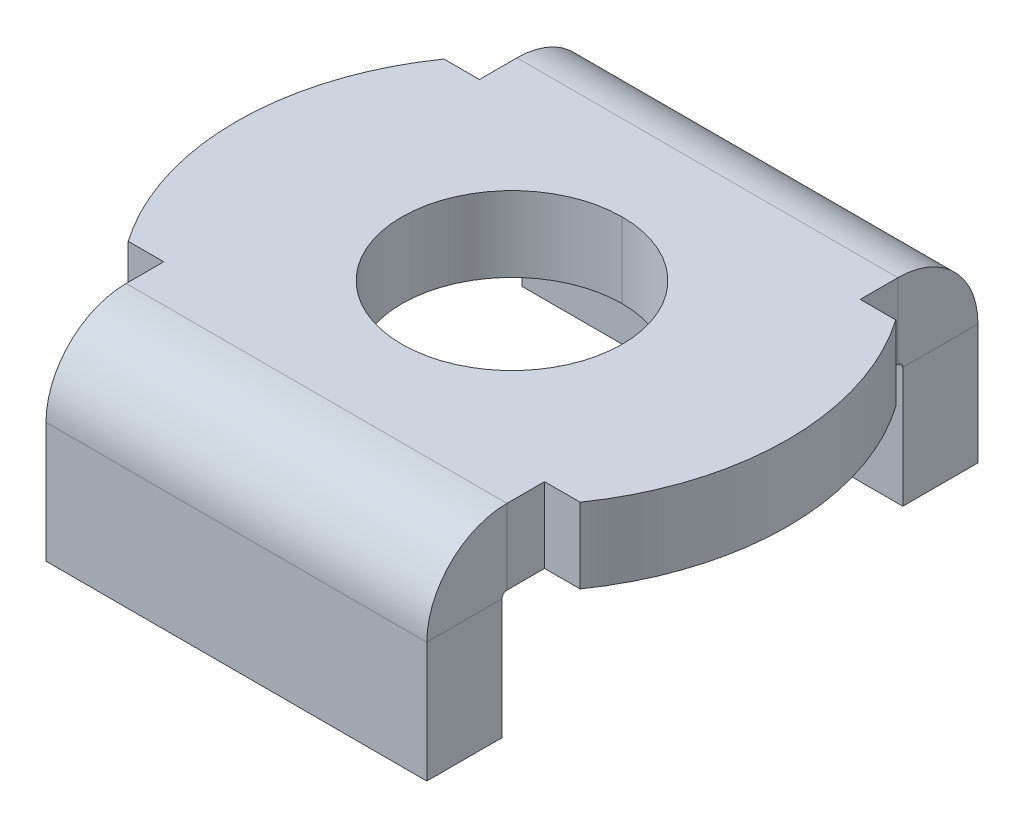
ISO-10303-21;
HEADER;
FILE_DESCRIPTION(('STEP AP214'),'2;1');
FILE_NAME('part.step','',(''),(''),'','','');
FILE_SCHEMA(('AUTOMOTIVE_DESIGN { 1 0 10303 214 1 1 1 1 }'));
ENDSEC;
DATA;
#1=APPLICATION_CONTEXT('core data for automotive mechanical design processes');
#2=APPLICATION_PROTOCOL_DEFINITION('international standard','automotive_design',2000,#1);
#3=PRODUCT_CONTEXT('',#1,'mechanical');
#4=PRODUCT('Part','Part','',(#3));
#5=PRODUCT_RELATED_PRODUCT_CATEGORY('part','',(#4));
#6=PRODUCT_DEFINITION_FORMATION('','',#4);
#7=PRODUCT_DEFINITION_CONTEXT('part definition',#1,'design');
#8=PRODUCT_DEFINITION('design','',#6,#7);
#9=PRODUCT_DEFINITION_SHAPE('','',#8);
#10=(LENGTH_UNIT() NAMED_UNIT(*) SI_UNIT(.MILLI.,.METRE.));
#11=(NAMED_UNIT(*) PLANE_ANGLE_UNIT() SI_UNIT($,.RADIAN.));
#12=(NAMED_UNIT(*) SI_UNIT($,.STERADIAN.) SOLID_ANGLE_UNIT());
#13=UNCERTAINTY_MEASURE_WITH_UNIT(LENGTH_MEASURE(1.E-05),#10,'distance_accuracy_value','');
#14=(GEOMETRIC_REPRESENTATION_CONTEXT(3) GLOBAL_UNCERTAINTY_ASSIGNED_CONTEXT((#13)) GLOBAL_UNIT_ASSIGNED_CONTEXT((#10,
#11,#12)) REPRESENTATION_CONTEXT('',''));
#15=CARTESIAN_POINT('',(0.,0.,0.));
#16=DIRECTION('',(0.,0.,1.));
#17=DIRECTION('',(1.,0.,0.));
#18=AXIS2_PLACEMENT_3D('',#15,#16,#17);
#19=CARTESIAN_POINT('',(-3.8,-4.,-5.5));
#20=DIRECTION('',(0.,1.,0.));
#21=DIRECTION('',(0.,0.,-1.));
#22=AXIS2_PLACEMENT_3D('',#19,#20,#21);
#23=PLANE('',#22);
#24=DIRECTION('',(-1.,0.,0.));
#25=VECTOR('',#24,1.);
#26=CARTESIAN_POINT('',(-3.8,-4.,-4.));
#27=LINE('',#26,#25);
#28=CARTESIAN_POINT('',(3.8,-4.,-4.));
#29=VERTEX_POINT('',#28);
#30=CARTESIAN_POINT('',(-3.8,-4.,-4.));
#31=VERTEX_POINT('',#30);
#32=EDGE_CURVE('E11',#29,#31,#27,.T.);
#33=ORIENTED_EDGE('',*,*,#32,.T.);
#34=DIRECTION('',(0.,0.,1.));
#35=VECTOR('',#34,1.);
#36=CARTESIAN_POINT('',(-3.8,-4.,-5.5));
#37=LINE('',#36,#35);
#38=CARTESIAN_POINT('',(-3.8,-4.,-5.5));
#39=VERTEX_POINT('',#38);
#40=EDGE_CURVE('E242',#39,#31,#37,.T.);
#41=ORIENTED_EDGE('',*,*,#40,.F.);
#42=DIRECTION('',(-1.,0.,0.));
#43=VECTOR('',#42,1.);
#44=CARTESIAN_POINT('',(-3.8,-4.,-5.5));
#45=LINE('',#44,#43);
#46=CARTESIAN_POINT('',(3.8,-4.,-5.5));
#47=VERTEX_POINT('',#46);
#48=EDGE_CURVE('E27',#47,#39,#45,.T.);
#49=ORIENTED_EDGE('',*,*,#48,.F.);
#50=DIRECTION('',(0.,0.,1.));
#51=VECTOR('',#50,1.);
#52=CARTESIAN_POINT('',(3.8,-4.,-5.5));
#53=LINE('',#52,#51);
#54=EDGE_CURVE('E508',#47,#29,#53,.T.);
#55=ORIENTED_EDGE('',*,*,#54,.T.);
#56=EDGE_LOOP('',(#33,#41,#49,#55));
#57=FACE_BOUND('',#56,.T.);
#58=ADVANCED_FACE('F17',(#57),#23,.F.);
#59=CARTESIAN_POINT('',(0.,0.,-4.));
#60=DIRECTION('',(0.,0.,1.));
#61=DIRECTION('',(0.,-1.,0.));
#62=AXIS2_PLACEMENT_3D('',#59,#60,#61);
#63=PLANE('',#62);
#64=DIRECTION('',(0.,-1.,0.));
#65=VECTOR('',#64,1.);
#66=CARTESIAN_POINT('',(3.8,-4.,-4.));
#67=LINE('',#66,#65);
#68=CARTESIAN_POINT('',(3.8,-1.6,-4.));
#69=VERTEX_POINT('',#68);
#70=EDGE_CURVE('E415',#69,#29,#67,.T.);
#71=ORIENTED_EDGE('',*,*,#70,.F.);
#72=DIRECTION('',(1.,0.,0.));
#73=VECTOR('',#72,1.);
#74=CARTESIAN_POINT('',(-3.8,-1.6,-4.));
#75=LINE('',#74,#73);
#76=CARTESIAN_POINT('',(-3.8,-1.6,-4.));
#77=VERTEX_POINT('',#76);
#78=EDGE_CURVE('E411',#77,#69,#75,.T.);
#79=ORIENTED_EDGE('',*,*,#78,.F.);
#80=DIRECTION('',(0.,1.,0.));
#81=VECTOR('',#80,1.);
#82=CARTESIAN_POINT('',(-3.8,-1.5,-4.));
#83=LINE('',#82,#81);
#84=EDGE_CURVE('E239',#31,#77,#83,.T.);
#85=ORIENTED_EDGE('',*,*,#84,.F.);
#86=ORIENTED_EDGE('',*,*,#32,.F.);
#87=EDGE_LOOP('',(#71,#79,#85,#86));
#88=FACE_BOUND('',#87,.T.);
#89=ADVANCED_FACE('F920',(#88),#63,.T.);
#90=CARTESIAN_POINT('',(0.,0.,-5.5));
#91=DIRECTION('',(0.,0.,1.));
#92=DIRECTION('',(0.,-1.,0.));
#93=AXIS2_PLACEMENT_3D('',#90,#91,#92);
#94=PLANE('',#93);
#95=DIRECTION('',(-1.,0.,0.));
#96=VECTOR('',#95,1.);
#97=CARTESIAN_POINT('',(0.,-1.6,-5.5));
#98=LINE('',#97,#96);
#99=CARTESIAN_POINT('',(3.8,-1.6,-5.5));
#100=VERTEX_POINT('',#99);
#101=CARTESIAN_POINT('',(-3.8,-1.6,-5.5));
#102=VERTEX_POINT('',#101);
#103=EDGE_CURVE('E21',#100,#102,#98,.T.);
#104=ORIENTED_EDGE('',*,*,#103,.F.);
#105=DIRECTION('',(0.,-1.,0.));
#106=VECTOR('',#105,1.);
#107=CARTESIAN_POINT('',(3.8,-4.,-5.5));
#108=LINE('',#107,#106);
#109=EDGE_CURVE('E410',#100,#47,#108,.T.);
#110=ORIENTED_EDGE('',*,*,#109,.T.);
#111=ORIENTED_EDGE('',*,*,#48,.T.);
#112=DIRECTION('',(0.,1.,0.));
#113=VECTOR('',#112,1.);
#114=CARTESIAN_POINT('',(-3.8,-1.5,-5.5));
#115=LINE('',#114,#113);
#116=EDGE_CURVE('E407',#39,#102,#115,.T.);
#117=ORIENTED_EDGE('',*,*,#116,.T.);
#118=EDGE_LOOP('',(#104,#110,#111,#117));
#119=FACE_BOUND('',#118,.T.);
#120=ADVANCED_FACE('F925',(#119),#94,.F.);
#121=CARTESIAN_POINT('',(-3.8,-1.5,-5.5));
#122=DIRECTION('',(1.,0.,0.));
#123=DIRECTION('',(0.,1.,0.));
#124=AXIS2_PLACEMENT_3D('',#121,#122,#123);
#125=PLANE('',#124);
#126=DIRECTION('',(0.,0.,-1.));
#127=VECTOR('',#126,1.);
#128=CARTESIAN_POINT('',(-3.8,-1.6,-4.));
#129=LINE('',#128,#127);
#130=EDGE_CURVE('E210',#77,#102,#129,.T.);
#131=ORIENTED_EDGE('',*,*,#130,.T.);
#132=ORIENTED_EDGE('',*,*,#116,.F.);
#133=ORIENTED_EDGE('',*,*,#40,.T.);
#134=ORIENTED_EDGE('',*,*,#84,.T.);
#135=EDGE_LOOP('',(#131,#132,#133,#134));
#136=FACE_BOUND('',#135,.T.);
#137=ADVANCED_FACE('F948',(#136),#125,.F.);
#138=CARTESIAN_POINT('',(3.8,-4.,-5.5));
#139=DIRECTION('',(-1.,0.,0.));
#140=DIRECTION('',(0.,0.,1.));
#141=AXIS2_PLACEMENT_3D('',#138,#139,#140);
#142=PLANE('',#141);
#143=DIRECTION('',(0.,0.,-1.));
#144=VECTOR('',#143,1.);
#145=CARTESIAN_POINT('',(3.8,-1.6,-4.));
#146=LINE('',#145,#144);
#147=EDGE_CURVE('E309',#69,#100,#146,.T.);
#148=ORIENTED_EDGE('',*,*,#147,.F.);
#149=ORIENTED_EDGE('',*,*,#70,.T.);
#150=ORIENTED_EDGE('',*,*,#54,.F.);
#151=ORIENTED_EDGE('',*,*,#109,.F.);
#152=EDGE_LOOP('',(#148,#149,#150,#151));
#153=FACE_BOUND('',#152,.T.);
#154=ADVANCED_FACE('F1011',(#153),#142,.F.);
#155=CARTESIAN_POINT('',(3.8,-1.6,-3.9));
#156=DIRECTION('',(1.,0.,0.));
#157=DIRECTION('',(0.,0.,-1.));
#158=AXIS2_PLACEMENT_3D('',#155,#156,#157);
#159=CYLINDRICAL_SURFACE('',#158,0.1);
#160=DIRECTION('',(-1.,0.,0.));
#161=VECTOR('',#160,1.);
#162=CARTESIAN_POINT('',(3.8,-1.5,-3.9));
#163=LINE('',#162,#161);
#164=CARTESIAN_POINT('',(3.8,-1.5,-3.9));
#165=VERTEX_POINT('',#164);
#166=CARTESIAN_POINT('',(-3.8,-1.5,-3.9));
#167=VERTEX_POINT('',#166);
#168=EDGE_CURVE('E281',#165,#167,#163,.T.);
#169=ORIENTED_EDGE('',*,*,#168,.T.);
#170=CARTESIAN_POINT('',(-3.8,-1.6,-3.9));
#171=DIRECTION('',(-1.,0.,0.));
#172=DIRECTION('',(0.,0.,-1.));
#173=AXIS2_PLACEMENT_3D('',#170,#171,#172);
#174=CIRCLE('',#173,0.1);
#175=EDGE_CURVE('E255',#167,#77,#174,.T.);
#176=ORIENTED_EDGE('',*,*,#175,.T.);
#177=ORIENTED_EDGE('',*,*,#78,.T.);
#178=CARTESIAN_POINT('',(3.8,-1.6,-3.9));
#179=DIRECTION('',(1.,0.,0.));
#180=DIRECTION('',(0.,0.,-1.));
#181=AXIS2_PLACEMENT_3D('',#178,#179,#180);
#182=CIRCLE('',#181,0.1);
#183=EDGE_CURVE('E314',#69,#165,#182,.T.);
#184=ORIENTED_EDGE('',*,*,#183,.T.);
#185=EDGE_LOOP('',(#169,#176,#177,#184));
#186=FACE_BOUND('',#185,.T.);
#187=ADVANCED_FACE('F544',(#186),#159,.F.);
#188=CARTESIAN_POINT('',(3.8,-1.6,-3.9));
#189=DIRECTION('',(1.,0.,0.));
#190=DIRECTION('',(0.,0.,-1.));
#191=AXIS2_PLACEMENT_3D('',#188,#189,#190);
#192=CYLINDRICAL_SURFACE('',#191,1.6);
#193=DIRECTION('',(-1.,0.,0.));
#194=VECTOR('',#193,1.);
#195=CARTESIAN_POINT('',(3.8,0.,-3.9));
#196=LINE('',#195,#194);
#197=CARTESIAN_POINT('',(3.8,0.,-3.9));
#198=VERTEX_POINT('',#197);
#199=CARTESIAN_POINT('',(-3.8,0.,-3.9));
#200=VERTEX_POINT('',#199);
#201=EDGE_CURVE('E367',#198,#200,#196,.T.);
#202=ORIENTED_EDGE('',*,*,#201,.F.);
#203=CARTESIAN_POINT('',(3.8,-1.6,-3.9));
#204=DIRECTION('',(1.,0.,0.));
#205=DIRECTION('',(0.,0.,-1.));
#206=AXIS2_PLACEMENT_3D('',#203,#204,#205);
#207=CIRCLE('',#206,1.6);
#208=EDGE_CURVE('E313',#100,#198,#207,.T.);
#209=ORIENTED_EDGE('',*,*,#208,.F.);
#210=ORIENTED_EDGE('',*,*,#103,.T.);
#211=CARTESIAN_POINT('',(-3.8,-1.6,-3.9));
#212=DIRECTION('',(-1.,0.,0.));
#213=DIRECTION('',(0.,0.,-1.));
#214=AXIS2_PLACEMENT_3D('',#211,#212,#213);
#215=CIRCLE('',#214,1.6);
#216=EDGE_CURVE('E259',#200,#102,#215,.T.);
#217=ORIENTED_EDGE('',*,*,#216,.F.);
#218=EDGE_LOOP('',(#202,#209,#210,#217));
#219=FACE_BOUND('',#218,.T.);
#220=ADVANCED_FACE('F536',(#219),#192,.T.);
#221=CARTESIAN_POINT('',(3.8,-1.6,-3.9));
#222=DIRECTION('',(-1.,0.,0.));
#223=DIRECTION('',(0.,0.,1.));
#224=AXIS2_PLACEMENT_3D('',#221,#222,#223);
#225=PLANE('',#224);
#226=ORIENTED_EDGE('',*,*,#183,.F.);
#227=ORIENTED_EDGE('',*,*,#147,.T.);
#228=ORIENTED_EDGE('',*,*,#208,.T.);
#229=DIRECTION('',(0.,1.,0.));
#230=VECTOR('',#229,1.);
#231=CARTESIAN_POINT('',(3.8,-1.5,-3.9));
#232=LINE('',#231,#230);
#233=EDGE_CURVE('E512',#165,#198,#232,.T.);
#234=ORIENTED_EDGE('',*,*,#233,.F.);
#235=EDGE_LOOP('',(#226,#227,#228,#234));
#236=FACE_BOUND('',#235,.T.);
#237=ADVANCED_FACE('F1000',(#236),#225,.F.);
#238=CARTESIAN_POINT('',(-3.8,-1.6,-3.9));
#239=DIRECTION('',(-1.,0.,0.));
#240=DIRECTION('',(0.,0.,1.));
#241=AXIS2_PLACEMENT_3D('',#238,#239,#240);
#242=PLANE('',#241);
#243=ORIENTED_EDGE('',*,*,#130,.F.);
#244=ORIENTED_EDGE('',*,*,#175,.F.);
#245=DIRECTION('',(0.,1.,0.));
#246=VECTOR('',#245,1.);
#247=CARTESIAN_POINT('',(-3.8,-1.5,-3.9));
#248=LINE('',#247,#246);
#249=EDGE_CURVE('E509',#167,#200,#248,.T.);
#250=ORIENTED_EDGE('',*,*,#249,.T.);
#251=ORIENTED_EDGE('',*,*,#216,.T.);
#252=EDGE_LOOP('',(#243,#244,#250,#251));
#253=FACE_BOUND('',#252,.T.);
#254=ADVANCED_FACE('F541',(#253),#242,.T.);
#255=CARTESIAN_POINT('',(3.8,-4.,5.5));
#256=DIRECTION('',(0.,1.,0.));
#257=DIRECTION('',(0.,0.,-1.));
#258=AXIS2_PLACEMENT_3D('',#255,#256,#257);
#259=PLANE('',#258);
#260=DIRECTION('',(1.,0.,0.));
#261=VECTOR('',#260,1.);
#262=CARTESIAN_POINT('',(3.8,-4.,4.));
#263=LINE('',#262,#261);
#264=CARTESIAN_POINT('',(-3.8,-4.,4.));
#265=VERTEX_POINT('',#264);
#266=CARTESIAN_POINT('',(3.8,-4.,4.));
#267=VERTEX_POINT('',#266);
#268=EDGE_CURVE('E197',#265,#267,#263,.T.);
#269=ORIENTED_EDGE('',*,*,#268,.T.);
#270=DIRECTION('',(0.,0.,-1.));
#271=VECTOR('',#270,1.);
#272=CARTESIAN_POINT('',(3.8,-4.,5.5));
#273=LINE('',#272,#271);
#274=CARTESIAN_POINT('',(3.8,-4.,5.5));
#275=VERTEX_POINT('',#274);
#276=EDGE_CURVE('E381',#275,#267,#273,.T.);
#277=ORIENTED_EDGE('',*,*,#276,.F.);
#278=DIRECTION('',(1.,0.,0.));
#279=VECTOR('',#278,1.);
#280=CARTESIAN_POINT('',(3.8,-4.,5.5));
#281=LINE('',#280,#279);
#282=CARTESIAN_POINT('',(-3.8,-4.,5.5));
#283=VERTEX_POINT('',#282);
#284=EDGE_CURVE('E211',#283,#275,#281,.T.);
#285=ORIENTED_EDGE('',*,*,#284,.F.);
#286=DIRECTION('',(0.,0.,-1.));
#287=VECTOR('',#286,1.);
#288=CARTESIAN_POINT('',(-3.8,-4.,5.5));
#289=LINE('',#288,#287);
#290=EDGE_CURVE('E214',#283,#265,#289,.T.);
#291=ORIENTED_EDGE('',*,*,#290,.T.);
#292=EDGE_LOOP('',(#269,#277,#285,#291));
#293=FACE_BOUND('',#292,.T.);
#294=ADVANCED_FACE('F215',(#293),#259,.F.);
#295=CARTESIAN_POINT('',(0.,0.,4.));
#296=DIRECTION('',(0.,0.,-1.));
#297=DIRECTION('',(0.,-1.,0.));
#298=AXIS2_PLACEMENT_3D('',#295,#296,#297);
#299=PLANE('',#298);
#300=DIRECTION('',(0.,-1.,0.));
#301=VECTOR('',#300,1.);
#302=CARTESIAN_POINT('',(-3.8,-4.,4.));
#303=LINE('',#302,#301);
#304=CARTESIAN_POINT('',(-3.8,-1.6,4.));
#305=VERTEX_POINT('',#304);
#306=EDGE_CURVE('E202',#305,#265,#303,.T.);
#307=ORIENTED_EDGE('',*,*,#306,.F.);
#308=DIRECTION('',(-1.,0.,0.));
#309=VECTOR('',#308,1.);
#310=CARTESIAN_POINT('',(3.8,-1.6,4.));
#311=LINE('',#310,#309);
#312=CARTESIAN_POINT('',(3.8,-1.6,4.));
#313=VERTEX_POINT('',#312);
#314=EDGE_CURVE('E227',#313,#305,#311,.T.);
#315=ORIENTED_EDGE('',*,*,#314,.F.);
#316=DIRECTION('',(0.,1.,0.));
#317=VECTOR('',#316,1.);
#318=CARTESIAN_POINT('',(3.8,-1.5,4.));
#319=LINE('',#318,#317);
#320=EDGE_CURVE('E205',#267,#313,#319,.T.);
#321=ORIENTED_EDGE('',*,*,#320,.F.);
#322=ORIENTED_EDGE('',*,*,#268,.F.);
#323=EDGE_LOOP('',(#307,#315,#321,#322));
#324=FACE_BOUND('',#323,.T.);
#325=ADVANCED_FACE('F199',(#324),#299,.T.);
#326=CARTESIAN_POINT('',(0.,0.,5.5));
#327=DIRECTION('',(0.,0.,-1.));
#328=DIRECTION('',(0.,-1.,0.));
#329=AXIS2_PLACEMENT_3D('',#326,#327,#328);
#330=PLANE('',#329);
#331=DIRECTION('',(1.,0.,0.));
#332=VECTOR('',#331,1.);
#333=CARTESIAN_POINT('',(0.,-1.6,5.5));
#334=LINE('',#333,#332);
#335=CARTESIAN_POINT('',(-3.8,-1.6,5.5));
#336=VERTEX_POINT('',#335);
#337=CARTESIAN_POINT('',(3.8,-1.6,5.5));
#338=VERTEX_POINT('',#337);
#339=EDGE_CURVE('E233',#336,#338,#334,.T.);
#340=ORIENTED_EDGE('',*,*,#339,.F.);
#341=DIRECTION('',(0.,-1.,0.));
#342=VECTOR('',#341,1.);
#343=CARTESIAN_POINT('',(-3.8,-4.,5.5));
#344=LINE('',#343,#342);
#345=EDGE_CURVE('E220',#336,#283,#344,.T.);
#346=ORIENTED_EDGE('',*,*,#345,.T.);
#347=ORIENTED_EDGE('',*,*,#284,.T.);
#348=DIRECTION('',(0.,1.,0.));
#349=VECTOR('',#348,1.);
#350=CARTESIAN_POINT('',(3.8,-1.5,5.5));
#351=LINE('',#350,#349);
#352=EDGE_CURVE('E390',#275,#338,#351,.T.);
#353=ORIENTED_EDGE('',*,*,#352,.T.);
#354=EDGE_LOOP('',(#340,#346,#347,#353));
#355=FACE_BOUND('',#354,.T.);
#356=ADVANCED_FACE('F487',(#355),#330,.F.);
#357=CARTESIAN_POINT('',(3.8,-1.5,5.5));
#358=DIRECTION('',(-1.,0.,0.));
#359=DIRECTION('',(0.,0.,1.));
#360=AXIS2_PLACEMENT_3D('',#357,#358,#359);
#361=PLANE('',#360);
#362=DIRECTION('',(0.,0.,1.));
#363=VECTOR('',#362,1.);
#364=CARTESIAN_POINT('',(3.8,-1.6,4.));
#365=LINE('',#364,#363);
#366=EDGE_CURVE('E268',#313,#338,#365,.T.);
#367=ORIENTED_EDGE('',*,*,#366,.T.);
#368=ORIENTED_EDGE('',*,*,#352,.F.);
#369=ORIENTED_EDGE('',*,*,#276,.T.);
#370=ORIENTED_EDGE('',*,*,#320,.T.);
#371=EDGE_LOOP('',(#367,#368,#369,#370));
#372=FACE_BOUND('',#371,.T.);
#373=ADVANCED_FACE('F490',(#372),#361,.F.);
#374=CARTESIAN_POINT('',(-3.8,-4.,5.5));
#375=DIRECTION('',(1.,0.,0.));
#376=DIRECTION('',(0.,1.,0.));
#377=AXIS2_PLACEMENT_3D('',#374,#375,#376);
#378=PLANE('',#377);
#379=DIRECTION('',(0.,0.,1.));
#380=VECTOR('',#379,1.);
#381=CARTESIAN_POINT('',(-3.8,-1.6,4.));
#382=LINE('',#381,#380);
#383=EDGE_CURVE('E224',#305,#336,#382,.T.);
#384=ORIENTED_EDGE('',*,*,#383,.F.);
#385=ORIENTED_EDGE('',*,*,#306,.T.);
#386=ORIENTED_EDGE('',*,*,#290,.F.);
#387=ORIENTED_EDGE('',*,*,#345,.F.);
#388=EDGE_LOOP('',(#384,#385,#386,#387));
#389=FACE_BOUND('',#388,.T.);
#390=ADVANCED_FACE('F223',(#389),#378,.F.);
#391=CARTESIAN_POINT('',(-3.8,-1.6,3.9));
#392=DIRECTION('',(-1.,0.,0.));
#393=DIRECTION('',(0.,0.,1.));
#394=AXIS2_PLACEMENT_3D('',#391,#392,#393);
#395=CYLINDRICAL_SURFACE('',#394,0.1);
#396=DIRECTION('',(1.,0.,0.));
#397=VECTOR('',#396,1.);
#398=CARTESIAN_POINT('',(-3.8,-1.5,3.9));
#399=LINE('',#398,#397);
#400=CARTESIAN_POINT('',(-3.8,-1.5,3.9));
#401=VERTEX_POINT('',#400);
#402=CARTESIAN_POINT('',(3.8,-1.5,3.9));
#403=VERTEX_POINT('',#402);
#404=EDGE_CURVE('E275',#401,#403,#399,.T.);
#405=ORIENTED_EDGE('',*,*,#404,.T.);
#406=CARTESIAN_POINT('',(3.8,-1.6,3.9));
#407=DIRECTION('',(1.,0.,0.));
#408=DIRECTION('',(0.,0.,1.));
#409=AXIS2_PLACEMENT_3D('',#406,#407,#408);
#410=CIRCLE('',#409,0.1);
#411=EDGE_CURVE('E264',#403,#313,#410,.T.);
#412=ORIENTED_EDGE('',*,*,#411,.T.);
#413=ORIENTED_EDGE('',*,*,#314,.T.);
#414=CARTESIAN_POINT('',(-3.8,-1.6,3.9));
#415=DIRECTION('',(-1.,0.,0.));
#416=DIRECTION('',(0.,0.,1.));
#417=AXIS2_PLACEMENT_3D('',#414,#415,#416);
#418=CIRCLE('',#417,0.1);
#419=EDGE_CURVE('E398',#305,#401,#418,.T.);
#420=ORIENTED_EDGE('',*,*,#419,.T.);
#421=EDGE_LOOP('',(#405,#412,#413,#420));
#422=FACE_BOUND('',#421,.T.);
#423=ADVANCED_FACE('F430',(#422),#395,.F.);
#424=CARTESIAN_POINT('',(-3.8,-1.6,3.9));
#425=DIRECTION('',(-1.,0.,0.));
#426=DIRECTION('',(0.,0.,1.));
#427=AXIS2_PLACEMENT_3D('',#424,#425,#426);
#428=CYLINDRICAL_SURFACE('',#427,1.6);
#429=DIRECTION('',(1.,0.,0.));
#430=VECTOR('',#429,1.);
#431=CARTESIAN_POINT('',(-3.8,0.,3.9));
#432=LINE('',#431,#430);
#433=CARTESIAN_POINT('',(-3.8,0.,3.9));
#434=VERTEX_POINT('',#433);
#435=CARTESIAN_POINT('',(3.8,0.,3.9));
#436=VERTEX_POINT('',#435);
#437=EDGE_CURVE('E243',#434,#436,#432,.T.);
#438=ORIENTED_EDGE('',*,*,#437,.F.);
#439=CARTESIAN_POINT('',(-3.8,-1.6,3.9));
#440=DIRECTION('',(-1.,0.,0.));
#441=DIRECTION('',(0.,0.,1.));
#442=AXIS2_PLACEMENT_3D('',#439,#440,#441);
#443=CIRCLE('',#442,1.6);
#444=EDGE_CURVE('E175',#336,#434,#443,.T.);
#445=ORIENTED_EDGE('',*,*,#444,.F.);
#446=ORIENTED_EDGE('',*,*,#339,.T.);
#447=CARTESIAN_POINT('',(3.8,-1.6,3.9));
#448=DIRECTION('',(1.,0.,0.));
#449=DIRECTION('',(0.,0.,1.));
#450=AXIS2_PLACEMENT_3D('',#447,#448,#449);
#451=CIRCLE('',#450,1.6);
#452=EDGE_CURVE('E188',#436,#338,#451,.T.);
#453=ORIENTED_EDGE('',*,*,#452,.F.);
#454=EDGE_LOOP('',(#438,#445,#446,#453));
#455=FACE_BOUND('',#454,.T.);
#456=ADVANCED_FACE('F497',(#455),#428,.T.);
#457=CARTESIAN_POINT('',(-3.8,-1.6,3.9));
#458=DIRECTION('',(1.,0.,0.));
#459=DIRECTION('',(0.,1.,0.));
#460=AXIS2_PLACEMENT_3D('',#457,#458,#459);
#461=PLANE('',#460);
#462=ORIENTED_EDGE('',*,*,#419,.F.);
#463=ORIENTED_EDGE('',*,*,#383,.T.);
#464=ORIENTED_EDGE('',*,*,#444,.T.);
#465=DIRECTION('',(0.,1.,0.));
#466=VECTOR('',#465,1.);
#467=CARTESIAN_POINT('',(-3.8,-1.5,3.9));
#468=LINE('',#467,#466);
#469=EDGE_CURVE('E340',#401,#434,#468,.T.);
#470=ORIENTED_EDGE('',*,*,#469,.F.);
#471=EDGE_LOOP('',(#462,#463,#464,#470));
#472=FACE_BOUND('',#471,.T.);
#473=ADVANCED_FACE('F433',(#472),#461,.F.);
#474=CARTESIAN_POINT('',(3.8,-1.6,3.9));
#475=DIRECTION('',(1.,0.,0.));
#476=DIRECTION('',(0.,1.,0.));
#477=AXIS2_PLACEMENT_3D('',#474,#475,#476);
#478=PLANE('',#477);
#479=ORIENTED_EDGE('',*,*,#366,.F.);
#480=ORIENTED_EDGE('',*,*,#411,.F.);
#481=DIRECTION('',(0.,1.,0.));
#482=VECTOR('',#481,1.);
#483=CARTESIAN_POINT('',(3.8,-1.5,3.9));
#484=LINE('',#483,#482);
#485=EDGE_CURVE('E319',#403,#436,#484,.T.);
#486=ORIENTED_EDGE('',*,*,#485,.T.);
#487=ORIENTED_EDGE('',*,*,#452,.T.);
#488=EDGE_LOOP('',(#479,#480,#486,#487));
#489=FACE_BOUND('',#488,.T.);
#490=ADVANCED_FACE('F493',(#489),#478,.T.);
#491=CARTESIAN_POINT('',(-3.8,-1.5,-3.15));
#492=DIRECTION('',(0.,0.,-1.));
#493=DIRECTION('',(-1.,0.,0.));
#494=AXIS2_PLACEMENT_3D('',#491,#492,#493);
#495=PLANE('',#494);
#496=DIRECTION('',(0.,-1.,0.));
#497=VECTOR('',#496,1.);
#498=CARTESIAN_POINT('',(-4.50860288781347,-1.5,-3.15));
#499=LINE('',#498,#497);
#500=CARTESIAN_POINT('',(-4.50860288781347,0.,-3.15));
#501=VERTEX_POINT('',#500);
#502=CARTESIAN_POINT('',(-4.50860288781347,-1.5,-3.15));
#503=VERTEX_POINT('',#502);
#504=EDGE_CURVE('E269',#501,#503,#499,.T.);
#505=ORIENTED_EDGE('',*,*,#504,.F.);
#506=DIRECTION('',(-1.,0.,0.));
#507=VECTOR('',#506,1.);
#508=CARTESIAN_POINT('',(0.,0.,-3.15));
#509=LINE('',#508,#507);
#510=CARTESIAN_POINT('',(-3.8,0.,-3.15));
#511=VERTEX_POINT('',#510);
#512=EDGE_CURVE('E366',#511,#501,#509,.T.);
#513=ORIENTED_EDGE('',*,*,#512,.F.);
#514=DIRECTION('',(0.,1.,0.));
#515=VECTOR('',#514,1.);
#516=CARTESIAN_POINT('',(-3.8,-1.5,-3.15));
#517=LINE('',#516,#515);
#518=CARTESIAN_POINT('',(-3.8,-1.5,-3.15));
#519=VERTEX_POINT('',#518);
#520=EDGE_CURVE('E350',#519,#511,#517,.T.);
#521=ORIENTED_EDGE('',*,*,#520,.F.);
#522=DIRECTION('',(-1.,0.,0.));
#523=VECTOR('',#522,1.);
#524=CARTESIAN_POINT('',(-3.8,-1.5,-3.15));
#525=LINE('',#524,#523);
#526=EDGE_CURVE('E358',#519,#503,#525,.T.);
#527=ORIENTED_EDGE('',*,*,#526,.T.);
#528=EDGE_LOOP('',(#505,#513,#521,#527));
#529=FACE_BOUND('',#528,.T.);
#530=ADVANCED_FACE('F527',(#529),#495,.T.);
#531=CARTESIAN_POINT('',(-3.8,-1.5,-3.9));
#532=DIRECTION('',(-1.,0.,0.));
#533=DIRECTION('',(0.,0.,1.));
#534=AXIS2_PLACEMENT_3D('',#531,#532,#533);
#535=PLANE('',#534);
#536=DIRECTION('',(0.,0.,1.));
#537=VECTOR('',#536,1.);
#538=CARTESIAN_POINT('',(-3.8,0.,0.));
#539=LINE('',#538,#537);
#540=EDGE_CURVE('E362',#200,#511,#539,.T.);
#541=ORIENTED_EDGE('',*,*,#540,.F.);
#542=ORIENTED_EDGE('',*,*,#249,.F.);
#543=DIRECTION('',(0.,0.,1.));
#544=VECTOR('',#543,1.);
#545=CARTESIAN_POINT('',(-3.8,-1.5,-3.9));
#546=LINE('',#545,#544);
#547=EDGE_CURVE('E286',#167,#519,#546,.T.);
#548=ORIENTED_EDGE('',*,*,#547,.T.);
#549=ORIENTED_EDGE('',*,*,#520,.T.);
#550=EDGE_LOOP('',(#541,#542,#548,#549));
#551=FACE_BOUND('',#550,.T.);
#552=ADVANCED_FACE('F521',(#551),#535,.T.);
#553=CARTESIAN_POINT('',(3.8,-1.5,-3.15));
#554=DIRECTION('',(1.,0.,0.));
#555=DIRECTION('',(0.,1.,0.));
#556=AXIS2_PLACEMENT_3D('',#553,#554,#555);
#557=PLANE('',#556);
#558=DIRECTION('',(0.,0.,-1.));
#559=VECTOR('',#558,1.);
#560=CARTESIAN_POINT('',(3.8,0.,0.));
#561=LINE('',#560,#559);
#562=CARTESIAN_POINT('',(3.8,0.,-3.15));
#563=VERTEX_POINT('',#562);
#564=EDGE_CURVE('E326',#563,#198,#561,.T.);
#565=ORIENTED_EDGE('',*,*,#564,.F.);
#566=DIRECTION('',(0.,1.,0.));
#567=VECTOR('',#566,1.);
#568=CARTESIAN_POINT('',(3.8,-1.5,-3.15));
#569=LINE('',#568,#567);
#570=CARTESIAN_POINT('',(3.8,-1.5,-3.15));
#571=VERTEX_POINT('',#570);
#572=EDGE_CURVE('E318',#571,#563,#569,.T.);
#573=ORIENTED_EDGE('',*,*,#572,.F.);
#574=DIRECTION('',(0.,0.,-1.));
#575=VECTOR('',#574,1.);
#576=CARTESIAN_POINT('',(3.8,-1.5,-3.15));
#577=LINE('',#576,#575);
#578=EDGE_CURVE('E285',#571,#165,#577,.T.);
#579=ORIENTED_EDGE('',*,*,#578,.T.);
#580=ORIENTED_EDGE('',*,*,#233,.T.);
#581=EDGE_LOOP('',(#565,#573,#579,#580));
#582=FACE_BOUND('',#581,.T.);
#583=ADVANCED_FACE('F577',(#582),#557,.T.);
#584=CARTESIAN_POINT('',(4.55,-1.5,-3.15));
#585=DIRECTION('',(0.,0.,-1.));
#586=DIRECTION('',(-1.,0.,0.));
#587=AXIS2_PLACEMENT_3D('',#584,#585,#586);
#588=PLANE('',#587);
#589=DIRECTION('',(0.,1.,0.));
#590=VECTOR('',#589,1.);
#591=CARTESIAN_POINT('',(4.50860288781347,-1.5,-3.15));
#592=LINE('',#591,#590);
#593=CARTESIAN_POINT('',(4.50860288781347,-1.5,-3.15));
#594=VERTEX_POINT('',#593);
#595=CARTESIAN_POINT('',(4.50860288781347,0.,-3.15));
#596=VERTEX_POINT('',#595);
#597=EDGE_CURVE('E237',#594,#596,#592,.T.);
#598=ORIENTED_EDGE('',*,*,#597,.F.);
#599=DIRECTION('',(-1.,0.,0.));
#600=VECTOR('',#599,1.);
#601=CARTESIAN_POINT('',(4.55,-1.5,-3.15));
#602=LINE('',#601,#600);
#603=EDGE_CURVE('E291',#594,#571,#602,.T.);
#604=ORIENTED_EDGE('',*,*,#603,.T.);
#605=ORIENTED_EDGE('',*,*,#572,.T.);
#606=DIRECTION('',(-1.,0.,0.));
#607=VECTOR('',#606,1.);
#608=CARTESIAN_POINT('',(0.,0.,-3.15));
#609=LINE('',#608,#607);
#610=EDGE_CURVE('E308',#596,#563,#609,.T.);
#611=ORIENTED_EDGE('',*,*,#610,.F.);
#612=EDGE_LOOP('',(#598,#604,#605,#611));
#613=FACE_BOUND('',#612,.T.);
#614=ADVANCED_FACE('F576',(#613),#588,.T.);
#615=CARTESIAN_POINT('',(3.8,-1.5,3.15));
#616=DIRECTION('',(0.,0.,1.));
#617=DIRECTION('',(0.,-1.,0.));
#618=AXIS2_PLACEMENT_3D('',#615,#616,#617);
#619=PLANE('',#618);
#620=DIRECTION('',(0.,-1.,0.));
#621=VECTOR('',#620,1.);
#622=CARTESIAN_POINT('',(4.50860288781347,-1.5,3.15));
#623=LINE('',#622,#621);
#624=CARTESIAN_POINT('',(4.50860288781347,0.,3.15));
#625=VERTEX_POINT('',#624);
#626=CARTESIAN_POINT('',(4.50860288781347,-1.5,3.15));
#627=VERTEX_POINT('',#626);
#628=EDGE_CURVE('E303',#625,#627,#623,.T.);
#629=ORIENTED_EDGE('',*,*,#628,.F.);
#630=DIRECTION('',(1.,0.,0.));
#631=VECTOR('',#630,1.);
#632=CARTESIAN_POINT('',(0.,0.,3.15));
#633=LINE('',#632,#631);
#634=CARTESIAN_POINT('',(3.8,0.,3.15));
#635=VERTEX_POINT('',#634);
#636=EDGE_CURVE('E287',#635,#625,#633,.T.);
#637=ORIENTED_EDGE('',*,*,#636,.F.);
#638=DIRECTION('',(0.,1.,0.));
#639=VECTOR('',#638,1.);
#640=CARTESIAN_POINT('',(3.8,-1.5,3.15));
#641=LINE('',#640,#639);
#642=CARTESIAN_POINT('',(3.8,-1.5,3.15));
#643=VERTEX_POINT('',#642);
#644=EDGE_CURVE('E315',#643,#635,#641,.T.);
#645=ORIENTED_EDGE('',*,*,#644,.F.);
#646=DIRECTION('',(1.,0.,0.));
#647=VECTOR('',#646,1.);
#648=CARTESIAN_POINT('',(3.8,-1.5,3.15));
#649=LINE('',#648,#647);
#650=EDGE_CURVE('E295',#643,#627,#649,.T.);
#651=ORIENTED_EDGE('',*,*,#650,.T.);
#652=EDGE_LOOP('',(#629,#637,#645,#651));
#653=FACE_BOUND('',#652,.T.);
#654=ADVANCED_FACE('F1032',(#653),#619,.T.);
#655=CARTESIAN_POINT('',(3.8,-1.5,3.9));
#656=DIRECTION('',(1.,0.,0.));
#657=DIRECTION('',(0.,1.,0.));
#658=AXIS2_PLACEMENT_3D('',#655,#656,#657);
#659=PLANE('',#658);
#660=DIRECTION('',(0.,0.,-1.));
#661=VECTOR('',#660,1.);
#662=CARTESIAN_POINT('',(3.8,0.,0.));
#663=LINE('',#662,#661);
#664=EDGE_CURVE('E247',#436,#635,#663,.T.);
#665=ORIENTED_EDGE('',*,*,#664,.F.);
#666=ORIENTED_EDGE('',*,*,#485,.F.);
#667=DIRECTION('',(0.,0.,-1.));
#668=VECTOR('',#667,1.);
#669=CARTESIAN_POINT('',(3.8,-1.5,3.9));
#670=LINE('',#669,#668);
#671=EDGE_CURVE('E280',#403,#643,#670,.T.);
#672=ORIENTED_EDGE('',*,*,#671,.T.);
#673=ORIENTED_EDGE('',*,*,#644,.T.);
#674=EDGE_LOOP('',(#665,#666,#672,#673));
#675=FACE_BOUND('',#674,.T.);
#676=ADVANCED_FACE('F448',(#675),#659,.T.);
#677=CARTESIAN_POINT('',(-3.8,-1.5,3.15));
#678=DIRECTION('',(-1.,0.,0.));
#679=DIRECTION('',(0.,0.,1.));
#680=AXIS2_PLACEMENT_3D('',#677,#678,#679);
#681=PLANE('',#680);
#682=DIRECTION('',(0.,0.,1.));
#683=VECTOR('',#682,1.);
#684=CARTESIAN_POINT('',(-3.8,0.,0.));
#685=LINE('',#684,#683);
#686=CARTESIAN_POINT('',(-3.8,0.,3.15));
#687=VERTEX_POINT('',#686);
#688=EDGE_CURVE('E248',#687,#434,#685,.T.);
#689=ORIENTED_EDGE('',*,*,#688,.F.);
#690=DIRECTION('',(0.,1.,0.));
#691=VECTOR('',#690,1.);
#692=CARTESIAN_POINT('',(-3.8,-1.5,3.15));
#693=LINE('',#692,#691);
#694=CARTESIAN_POINT('',(-3.8,-1.5,3.15));
#695=VERTEX_POINT('',#694);
#696=EDGE_CURVE('E337',#695,#687,#693,.T.);
#697=ORIENTED_EDGE('',*,*,#696,.F.);
#698=DIRECTION('',(0.,0.,1.));
#699=VECTOR('',#698,1.);
#700=CARTESIAN_POINT('',(-3.8,-1.5,3.15));
#701=LINE('',#700,#699);
#702=EDGE_CURVE('E279',#695,#401,#701,.T.);
#703=ORIENTED_EDGE('',*,*,#702,.T.);
#704=ORIENTED_EDGE('',*,*,#469,.T.);
#705=EDGE_LOOP('',(#689,#697,#703,#704));
#706=FACE_BOUND('',#705,.T.);
#707=ADVANCED_FACE('F437',(#706),#681,.T.);
#708=CARTESIAN_POINT('',(-4.55,-1.5,3.15));
#709=DIRECTION('',(0.,0.,1.));
#710=DIRECTION('',(0.,-1.,0.));
#711=AXIS2_PLACEMENT_3D('',#708,#709,#710);
#712=PLANE('',#711);
#713=DIRECTION('',(0.,1.,0.));
#714=VECTOR('',#713,1.);
#715=CARTESIAN_POINT('',(-4.50860288781347,-1.5,3.15));
#716=LINE('',#715,#714);
#717=CARTESIAN_POINT('',(-4.50860288781347,-1.5,3.15));
#718=VERTEX_POINT('',#717);
#719=CARTESIAN_POINT('',(-4.50860288781347,0.,3.15));
#720=VERTEX_POINT('',#719);
#721=EDGE_CURVE('E296',#718,#720,#716,.T.);
#722=ORIENTED_EDGE('',*,*,#721,.F.);
#723=DIRECTION('',(1.,0.,0.));
#724=VECTOR('',#723,1.);
#725=CARTESIAN_POINT('',(-4.55,-1.5,3.15));
#726=LINE('',#725,#724);
#727=EDGE_CURVE('E361',#718,#695,#726,.T.);
#728=ORIENTED_EDGE('',*,*,#727,.T.);
#729=ORIENTED_EDGE('',*,*,#696,.T.);
#730=DIRECTION('',(1.,0.,0.));
#731=VECTOR('',#730,1.);
#732=CARTESIAN_POINT('',(0.,0.,3.15));
#733=LINE('',#732,#731);
#734=EDGE_CURVE('E354',#720,#687,#733,.T.);
#735=ORIENTED_EDGE('',*,*,#734,.F.);
#736=EDGE_LOOP('',(#722,#728,#729,#735));
#737=FACE_BOUND('',#736,.T.);
#738=ADVANCED_FACE('F19',(#737),#712,.T.);
#739=CARTESIAN_POINT('',(0.,-1.5,0.));
#740=DIRECTION('',(0.,1.,0.));
#741=DIRECTION('',(0.,0.,1.));
#742=AXIS2_PLACEMENT_3D('',#739,#740,#741);
#743=CYLINDRICAL_SURFACE('',#742,2.2);
#744=DIRECTION('',(0.,1.,0.));
#745=VECTOR('',#744,1.);
#746=CARTESIAN_POINT('',(0.,-1.5,-2.2));
#747=LINE('',#746,#745);
#748=CARTESIAN_POINT('',(0.,-1.5,-2.2));
#749=VERTEX_POINT('',#748);
#750=CARTESIAN_POINT('',(0.,0.,-2.2));
#751=VERTEX_POINT('',#750);
#752=EDGE_CURVE('E254',#749,#751,#747,.T.);
#753=ORIENTED_EDGE('',*,*,#752,.F.);
#754=CARTESIAN_POINT('',(0.,-1.5,0.));
#755=DIRECTION('',(0.,1.,0.));
#756=DIRECTION('',(0.,0.,1.));
#757=AXIS2_PLACEMENT_3D('',#754,#755,#756);
#758=CIRCLE('',#757,2.2);
#759=CARTESIAN_POINT('',(0.,-1.5,2.2));
#760=VERTEX_POINT('',#759);
#761=EDGE_CURVE('E304',#760,#749,#758,.T.);
#762=ORIENTED_EDGE('',*,*,#761,.F.);
#763=DIRECTION('',(0.,1.,0.));
#764=VECTOR('',#763,1.);
#765=CARTESIAN_POINT('',(0.,-1.5,2.2));
#766=LINE('',#765,#764);
#767=CARTESIAN_POINT('',(0.,0.,2.2));
#768=VERTEX_POINT('',#767);
#769=EDGE_CURVE('E253',#760,#768,#766,.T.);
#770=ORIENTED_EDGE('',*,*,#769,.T.);
#771=CARTESIAN_POINT('',(0.,0.,0.));
#772=DIRECTION('',(0.,1.,0.));
#773=DIRECTION('',(0.,0.,1.));
#774=AXIS2_PLACEMENT_3D('',#771,#772,#773);
#775=CIRCLE('',#774,2.2);
#776=EDGE_CURVE('E290',#768,#751,#775,.T.);
#777=ORIENTED_EDGE('',*,*,#776,.T.);
#778=EDGE_LOOP('',(#753,#762,#770,#777));
#779=FACE_BOUND('',#778,.T.);
#780=ADVANCED_FACE('F1056',(#779),#743,.F.);
#781=CARTESIAN_POINT('',(0.,0.,0.));
#782=DIRECTION('',(0.,1.,0.));
#783=DIRECTION('',(1.,0.,0.));
#784=AXIS2_PLACEMENT_3D('',#781,#782,#783);
#785=PLANE('',#784);
#786=ORIENTED_EDGE('',*,*,#776,.F.);
#787=CARTESIAN_POINT('',(0.,0.,0.));
#788=DIRECTION('',(0.,1.,0.));
#789=DIRECTION('',(0.,0.,1.));
#790=AXIS2_PLACEMENT_3D('',#787,#788,#789);
#791=CIRCLE('',#790,2.2);
#792=EDGE_CURVE('E249',#751,#768,#791,.T.);
#793=ORIENTED_EDGE('',*,*,#792,.F.);
#794=EDGE_LOOP('',(#786,#793));
#795=FACE_BOUND('',#794,.T.);
#796=CARTESIAN_POINT('',(0.,0.,0.));
#797=DIRECTION('',(0.,1.,0.));
#798=DIRECTION('',(0.,0.,1.));
#799=AXIS2_PLACEMENT_3D('',#796,#797,#798);
#800=CIRCLE('',#799,5.5);
#801=EDGE_CURVE('E299',#625,#596,#800,.T.);
#802=ORIENTED_EDGE('',*,*,#801,.T.);
#803=ORIENTED_EDGE('',*,*,#610,.T.);
#804=ORIENTED_EDGE('',*,*,#564,.T.);
#805=ORIENTED_EDGE('',*,*,#201,.T.);
#806=ORIENTED_EDGE('',*,*,#540,.T.);
#807=ORIENTED_EDGE('',*,*,#512,.T.);
#808=CARTESIAN_POINT('',(0.,0.,0.));
#809=DIRECTION('',(0.,1.,0.));
#810=DIRECTION('',(0.,0.,1.));
#811=AXIS2_PLACEMENT_3D('',#808,#809,#810);
#812=CIRCLE('',#811,5.5);
#813=EDGE_CURVE('E274',#501,#720,#812,.T.);
#814=ORIENTED_EDGE('',*,*,#813,.T.);
#815=ORIENTED_EDGE('',*,*,#734,.T.);
#816=ORIENTED_EDGE('',*,*,#688,.T.);
#817=ORIENTED_EDGE('',*,*,#437,.T.);
#818=ORIENTED_EDGE('',*,*,#664,.T.);
#819=ORIENTED_EDGE('',*,*,#636,.T.);
#820=EDGE_LOOP('',(#802,#803,#804,#805,#806,#807,#814,#815,#816,#817,#818,#819));
#821=FACE_BOUND('',#820,.T.);
#822=ADVANCED_FACE('F495',(#795,#821),#785,.T.);
#823=CARTESIAN_POINT('',(0.,-1.5,0.));
#824=DIRECTION('',(0.,1.,0.));
#825=DIRECTION('',(1.,0.,0.));
#826=AXIS2_PLACEMENT_3D('',#823,#824,#825);
#827=PLANE('',#826);
#828=ORIENTED_EDGE('',*,*,#761,.T.);
#829=CARTESIAN_POINT('',(0.,-1.5,0.));
#830=DIRECTION('',(0.,1.,0.));
#831=DIRECTION('',(0.,0.,1.));
#832=AXIS2_PLACEMENT_3D('',#829,#830,#831);
#833=CIRCLE('',#832,2.2);
#834=EDGE_CURVE('E263',#749,#760,#833,.T.);
#835=ORIENTED_EDGE('',*,*,#834,.T.);
#836=EDGE_LOOP('',(#828,#835));
#837=FACE_BOUND('',#836,.T.);
#838=ORIENTED_EDGE('',*,*,#603,.F.);
#839=CARTESIAN_POINT('',(0.,-1.5,0.));
#840=DIRECTION('',(0.,1.,0.));
#841=DIRECTION('',(0.,0.,1.));
#842=AXIS2_PLACEMENT_3D('',#839,#840,#841);
#843=CIRCLE('',#842,5.5);
#844=EDGE_CURVE('E378',#627,#594,#843,.T.);
#845=ORIENTED_EDGE('',*,*,#844,.F.);
#846=ORIENTED_EDGE('',*,*,#650,.F.);
#847=ORIENTED_EDGE('',*,*,#671,.F.);
#848=ORIENTED_EDGE('',*,*,#404,.F.);
#849=ORIENTED_EDGE('',*,*,#702,.F.);
#850=ORIENTED_EDGE('',*,*,#727,.F.);
#851=CARTESIAN_POINT('',(0.,-1.5,0.));
#852=DIRECTION('',(0.,1.,0.));
#853=DIRECTION('',(0.,0.,1.));
#854=AXIS2_PLACEMENT_3D('',#851,#852,#853);
#855=CIRCLE('',#854,5.5);
#856=EDGE_CURVE('E273',#503,#718,#855,.T.);
#857=ORIENTED_EDGE('',*,*,#856,.F.);
#858=ORIENTED_EDGE('',*,*,#526,.F.);
#859=ORIENTED_EDGE('',*,*,#547,.F.);
#860=ORIENTED_EDGE('',*,*,#168,.F.);
#861=ORIENTED_EDGE('',*,*,#578,.F.);
#862=EDGE_LOOP('',(#838,#845,#846,#847,#848,#849,#850,#857,#858,#859,#860,#861));
#863=FACE_BOUND('',#862,.T.);
#864=ADVANCED_FACE('F440',(#837,#863),#827,.F.);
#865=CARTESIAN_POINT('',(0.,-1.5,0.));
#866=DIRECTION('',(0.,1.,0.));
#867=DIRECTION('',(0.,0.,1.));
#868=AXIS2_PLACEMENT_3D('',#865,#866,#867);
#869=CYLINDRICAL_SURFACE('',#868,5.5);
#870=ORIENTED_EDGE('',*,*,#813,.F.);
#871=ORIENTED_EDGE('',*,*,#504,.T.);
#872=ORIENTED_EDGE('',*,*,#856,.T.);
#873=ORIENTED_EDGE('',*,*,#721,.T.);
#874=EDGE_LOOP('',(#870,#871,#872,#873));
#875=FACE_BOUND('',#874,.T.);
#876=ADVANCED_FACE('F907',(#875),#869,.T.);
#877=CARTESIAN_POINT('',(0.,-1.5,0.));
#878=DIRECTION('',(0.,1.,0.));
#879=DIRECTION('',(0.,0.,1.));
#880=AXIS2_PLACEMENT_3D('',#877,#878,#879);
#881=CYLINDRICAL_SURFACE('',#880,5.5);
#882=ORIENTED_EDGE('',*,*,#844,.T.);
#883=ORIENTED_EDGE('',*,*,#597,.T.);
#884=ORIENTED_EDGE('',*,*,#801,.F.);
#885=ORIENTED_EDGE('',*,*,#628,.T.);
#886=EDGE_LOOP('',(#882,#883,#884,#885));
#887=FACE_BOUND('',#886,.T.);
#888=ADVANCED_FACE('F583',(#887),#881,.T.);
#889=CARTESIAN_POINT('',(0.,-1.5,0.));
#890=DIRECTION('',(0.,1.,0.));
#891=DIRECTION('',(0.,0.,1.));
#892=AXIS2_PLACEMENT_3D('',#889,#890,#891);
#893=CYLINDRICAL_SURFACE('',#892,2.2);
#894=ORIENTED_EDGE('',*,*,#834,.F.);
#895=ORIENTED_EDGE('',*,*,#752,.T.);
#896=ORIENTED_EDGE('',*,*,#792,.T.);
#897=ORIENTED_EDGE('',*,*,#769,.F.);
#898=EDGE_LOOP('',(#894,#895,#896,#897));
#899=FACE_BOUND('',#898,.T.);
#900=ADVANCED_FACE('F1042',(#899),#893,.F.);
#901=CLOSED_SHELL('',(#58,#89,#120,#137,#154,#187,#220,#237,#254,#294,#325,#356,#373,#390,#423,
#456,#473,#490,#530,#552,#583,#614,#654,#676,#707,#738,#780,#822,#864,#876,#888,#900));
#902=MANIFOLD_SOLID_BREP('B1',#901);
#903=ADVANCED_BREP_SHAPE_REPRESENTATION('',(#18,#902),#14);
#904=SHAPE_DEFINITION_REPRESENTATION(#9,#903);
ENDSEC;
END-ISO-10303-21;
